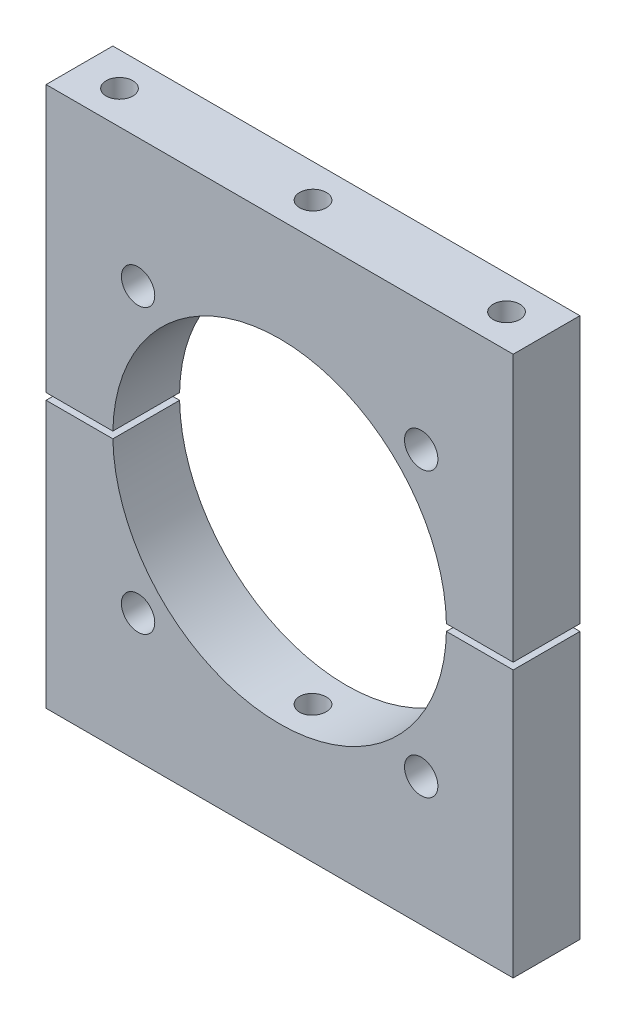
ISO-10303-21;
HEADER;
FILE_DESCRIPTION(('STEP AP214'),'2;1');
FILE_NAME('part.step','',(''),(''),'','','');
FILE_SCHEMA(('AUTOMOTIVE_DESIGN { 1 0 10303 214 1 1 1 1 }'));
ENDSEC;
DATA;
#1=APPLICATION_CONTEXT('core data for automotive mechanical design processes');
#2=APPLICATION_PROTOCOL_DEFINITION('international standard','automotive_design',2000,#1);
#3=PRODUCT_CONTEXT('',#1,'mechanical');
#4=PRODUCT('Part','Part','',(#3));
#5=PRODUCT_RELATED_PRODUCT_CATEGORY('part','',(#4));
#6=PRODUCT_DEFINITION_FORMATION('','',#4);
#7=PRODUCT_DEFINITION_CONTEXT('part definition',#1,'design');
#8=PRODUCT_DEFINITION('design','',#6,#7);
#9=PRODUCT_DEFINITION_SHAPE('','',#8);
#10=(LENGTH_UNIT() NAMED_UNIT(*) SI_UNIT(.MILLI.,.METRE.));
#11=(NAMED_UNIT(*) PLANE_ANGLE_UNIT() SI_UNIT($,.RADIAN.));
#12=(NAMED_UNIT(*) SI_UNIT($,.STERADIAN.) SOLID_ANGLE_UNIT());
#13=UNCERTAINTY_MEASURE_WITH_UNIT(LENGTH_MEASURE(1.E-05),#10,'distance_accuracy_value','');
#14=(GEOMETRIC_REPRESENTATION_CONTEXT(3) GLOBAL_UNCERTAINTY_ASSIGNED_CONTEXT((#13)) GLOBAL_UNIT_ASSIGNED_CONTEXT((#10,
#11,#12)) REPRESENTATION_CONTEXT('',''));
#15=CARTESIAN_POINT('',(0.,0.,0.));
#16=DIRECTION('',(0.,0.,1.));
#17=DIRECTION('',(1.,0.,0.));
#18=AXIS2_PLACEMENT_3D('',#15,#16,#17);
#19=CARTESIAN_POINT('',(0.,0.,10.));
#20=DIRECTION('',(1.,0.,0.));
#21=DIRECTION('',(0.,0.,-1.));
#22=AXIS2_PLACEMENT_3D('',#19,#20,#21);
#23=PLANE('',#22);
#24=DIRECTION('',(0.,-1.,0.));
#25=VECTOR('',#24,1.);
#26=CARTESIAN_POINT('',(0.,0.,10.));
#27=LINE('',#26,#25);
#28=CARTESIAN_POINT('',(0.,39.98,10.));
#29=VERTEX_POINT('',#28);
#30=CARTESIAN_POINT('',(0.,0.,10.));
#31=VERTEX_POINT('',#30);
#32=EDGE_CURVE('E130',#29,#31,#27,.T.);
#33=ORIENTED_EDGE('',*,*,#32,.F.);
#34=DIRECTION('',(0.,0.,1.));
#35=VECTOR('',#34,1.);
#36=CARTESIAN_POINT('',(0.,39.98,0.));
#37=LINE('',#36,#35);
#38=CARTESIAN_POINT('',(0.,39.98,0.));
#39=VERTEX_POINT('',#38);
#40=EDGE_CURVE('E12',#39,#29,#37,.T.);
#41=ORIENTED_EDGE('',*,*,#40,.F.);
#42=DIRECTION('',(0.,-1.,0.));
#43=VECTOR('',#42,1.);
#44=CARTESIAN_POINT('',(0.,0.,0.));
#45=LINE('',#44,#43);
#46=CARTESIAN_POINT('',(0.,0.,0.));
#47=VERTEX_POINT('',#46);
#48=EDGE_CURVE('E132',#39,#47,#45,.T.);
#49=ORIENTED_EDGE('',*,*,#48,.T.);
#50=DIRECTION('',(0.,0.,-1.));
#51=VECTOR('',#50,1.);
#52=CARTESIAN_POINT('',(0.,0.,10.));
#53=LINE('',#52,#51);
#54=EDGE_CURVE('E105',#31,#47,#53,.T.);
#55=ORIENTED_EDGE('',*,*,#54,.F.);
#56=EDGE_LOOP('',(#33,#41,#49,#55));
#57=FACE_BOUND('',#56,.T.);
#58=ADVANCED_FACE('F44',(#57),#23,.F.);
#59=CARTESIAN_POINT('',(0.,0.,10.));
#60=DIRECTION('',(0.,0.,-1.));
#61=DIRECTION('',(-1.,0.,0.));
#62=AXIS2_PLACEMENT_3D('',#59,#60,#61);
#63=PLANE('',#62);
#64=CARTESIAN_POINT('',(13.7867965644037,19.2667965644034,10.));
#65=DIRECTION('',(0.,0.,1.));
#66=DIRECTION('',(1.,0.,0.));
#67=AXIS2_PLACEMENT_3D('',#64,#65,#66);
#68=CIRCLE('',#67,2.50000000000004);
#69=CARTESIAN_POINT('',(16.2867965644037,19.2667965644034,10.));
#70=VERTEX_POINT('',#69);
#71=EDGE_CURVE('E211',#70,#70,#68,.T.);
#72=ORIENTED_EDGE('',*,*,#71,.F.);
#73=EDGE_LOOP('',(#72));
#74=FACE_BOUND('',#73,.T.);
#75=CARTESIAN_POINT('',(56.2132034355965,19.2667965644037,10.));
#76=DIRECTION('',(0.,0.,1.));
#77=DIRECTION('',(1.,0.,0.));
#78=AXIS2_PLACEMENT_3D('',#75,#76,#77);
#79=CIRCLE('',#78,2.50000000000004);
#80=CARTESIAN_POINT('',(58.7132034355966,19.2667965644037,10.));
#81=VERTEX_POINT('',#80);
#82=EDGE_CURVE('E205',#81,#81,#79,.T.);
#83=ORIENTED_EDGE('',*,*,#82,.F.);
#84=EDGE_LOOP('',(#83));
#85=FACE_BOUND('',#84,.T.);
#86=DIRECTION('',(0.,1.,0.));
#87=VECTOR('',#86,1.);
#88=CARTESIAN_POINT('',(70.,0.,10.));
#89=LINE('',#88,#87);
#90=CARTESIAN_POINT('',(70.,0.,10.));
#91=VERTEX_POINT('',#90);
#92=CARTESIAN_POINT('',(70.,39.98,10.));
#93=VERTEX_POINT('',#92);
#94=EDGE_CURVE('E117',#91,#93,#89,.T.);
#95=ORIENTED_EDGE('',*,*,#94,.T.);
#96=DIRECTION('',(1.,0.,0.));
#97=VECTOR('',#96,1.);
#98=CARTESIAN_POINT('',(70.,39.98,10.));
#99=LINE('',#98,#97);
#100=CARTESIAN_POINT('',(59.9949994999,39.98,10.));
#101=VERTEX_POINT('',#100);
#102=EDGE_CURVE('E118',#101,#93,#99,.T.);
#103=ORIENTED_EDGE('',*,*,#102,.F.);
#104=CARTESIAN_POINT('',(35.,40.48,10.));
#105=DIRECTION('',(0.,0.,1.));
#106=DIRECTION('',(1.,0.,0.));
#107=AXIS2_PLACEMENT_3D('',#104,#105,#106);
#108=CIRCLE('',#107,25.);
#109=CARTESIAN_POINT('',(10.0050005001,39.98,10.));
#110=VERTEX_POINT('',#109);
#111=EDGE_CURVE('E190',#110,#101,#108,.T.);
#112=ORIENTED_EDGE('',*,*,#111,.F.);
#113=DIRECTION('',(1.,0.,0.));
#114=VECTOR('',#113,1.);
#115=CARTESIAN_POINT('',(0.,39.98,10.));
#116=LINE('',#115,#114);
#117=EDGE_CURVE('E53',#29,#110,#116,.T.);
#118=ORIENTED_EDGE('',*,*,#117,.F.);
#119=ORIENTED_EDGE('',*,*,#32,.T.);
#120=DIRECTION('',(1.,0.,0.));
#121=VECTOR('',#120,1.);
#122=CARTESIAN_POINT('',(0.,0.,10.));
#123=LINE('',#122,#121);
#124=EDGE_CURVE('E179',#31,#91,#123,.T.);
#125=ORIENTED_EDGE('',*,*,#124,.T.);
#126=EDGE_LOOP('',(#95,#103,#112,#118,#119,#125));
#127=FACE_BOUND('',#126,.T.);
#128=ADVANCED_FACE('F170',(#74,#85,#127),#63,.F.);
#129=CARTESIAN_POINT('',(0.,0.,0.));
#130=DIRECTION('',(0.,0.,-1.));
#131=DIRECTION('',(-1.,0.,0.));
#132=AXIS2_PLACEMENT_3D('',#129,#130,#131);
#133=PLANE('',#132);
#134=CARTESIAN_POINT('',(13.7867965644037,19.2667965644034,0.));
#135=DIRECTION('',(0.,0.,1.));
#136=DIRECTION('',(1.,0.,0.));
#137=AXIS2_PLACEMENT_3D('',#134,#135,#136);
#138=CIRCLE('',#137,2.50000000000004);
#139=CARTESIAN_POINT('',(16.2867965644037,19.2667965644034,0.));
#140=VERTEX_POINT('',#139);
#141=EDGE_CURVE('E200',#140,#140,#138,.T.);
#142=ORIENTED_EDGE('',*,*,#141,.T.);
#143=EDGE_LOOP('',(#142));
#144=FACE_BOUND('',#143,.T.);
#145=CARTESIAN_POINT('',(56.2132034355965,19.2667965644037,0.));
#146=DIRECTION('',(0.,0.,1.));
#147=DIRECTION('',(1.,0.,0.));
#148=AXIS2_PLACEMENT_3D('',#145,#146,#147);
#149=CIRCLE('',#148,2.50000000000004);
#150=CARTESIAN_POINT('',(58.7132034355966,19.2667965644037,0.));
#151=VERTEX_POINT('',#150);
#152=EDGE_CURVE('E208',#151,#151,#149,.T.);
#153=ORIENTED_EDGE('',*,*,#152,.T.);
#154=EDGE_LOOP('',(#153));
#155=FACE_BOUND('',#154,.T.);
#156=DIRECTION('',(1.,0.,0.));
#157=VECTOR('',#156,1.);
#158=CARTESIAN_POINT('',(70.,39.98,0.));
#159=LINE('',#158,#157);
#160=CARTESIAN_POINT('',(59.9949994999,39.98,0.));
#161=VERTEX_POINT('',#160);
#162=CARTESIAN_POINT('',(70.,39.98,0.));
#163=VERTEX_POINT('',#162);
#164=EDGE_CURVE('E124',#161,#163,#159,.T.);
#165=ORIENTED_EDGE('',*,*,#164,.T.);
#166=DIRECTION('',(0.,1.,0.));
#167=VECTOR('',#166,1.);
#168=CARTESIAN_POINT('',(70.,0.,0.));
#169=LINE('',#168,#167);
#170=CARTESIAN_POINT('',(70.,0.,0.));
#171=VERTEX_POINT('',#170);
#172=EDGE_CURVE('E115',#171,#163,#169,.T.);
#173=ORIENTED_EDGE('',*,*,#172,.F.);
#174=DIRECTION('',(1.,0.,0.));
#175=VECTOR('',#174,1.);
#176=CARTESIAN_POINT('',(0.,0.,0.));
#177=LINE('',#176,#175);
#178=EDGE_CURVE('E98',#47,#171,#177,.T.);
#179=ORIENTED_EDGE('',*,*,#178,.F.);
#180=ORIENTED_EDGE('',*,*,#48,.F.);
#181=DIRECTION('',(1.,0.,0.));
#182=VECTOR('',#181,1.);
#183=CARTESIAN_POINT('',(0.,39.98,0.));
#184=LINE('',#183,#182);
#185=CARTESIAN_POINT('',(10.0050005001,39.98,0.));
#186=VERTEX_POINT('',#185);
#187=EDGE_CURVE('E183',#39,#186,#184,.T.);
#188=ORIENTED_EDGE('',*,*,#187,.T.);
#189=CARTESIAN_POINT('',(35.,40.48,0.));
#190=DIRECTION('',(0.,0.,1.));
#191=DIRECTION('',(1.,0.,0.));
#192=AXIS2_PLACEMENT_3D('',#189,#190,#191);
#193=CIRCLE('',#192,25.);
#194=EDGE_CURVE('E109',#186,#161,#193,.T.);
#195=ORIENTED_EDGE('',*,*,#194,.T.);
#196=EDGE_LOOP('',(#165,#173,#179,#180,#188,#195));
#197=FACE_BOUND('',#196,.T.);
#198=ADVANCED_FACE('F122',(#144,#155,#197),#133,.T.);
#199=CARTESIAN_POINT('',(0.,0.,10.));
#200=DIRECTION('',(0.,1.,0.));
#201=DIRECTION('',(0.,0.,1.));
#202=AXIS2_PLACEMENT_3D('',#199,#200,#201);
#203=PLANE('',#202);
#204=CARTESIAN_POINT('',(5.99999999999998,0.,5.));
#205=DIRECTION('',(0.,1.,0.));
#206=DIRECTION('',(-1.,0.,0.));
#207=AXIS2_PLACEMENT_3D('',#204,#205,#206);
#208=CIRCLE('',#207,2.);
#209=CARTESIAN_POINT('',(3.99999999999998,0.,5.));
#210=VERTEX_POINT('',#209);
#211=EDGE_CURVE('E137',#210,#210,#208,.T.);
#212=ORIENTED_EDGE('',*,*,#211,.T.);
#213=EDGE_LOOP('',(#212));
#214=FACE_BOUND('',#213,.T.);
#215=CARTESIAN_POINT('',(64.,0.,5.));
#216=DIRECTION('',(0.,1.,0.));
#217=DIRECTION('',(-1.,0.,0.));
#218=AXIS2_PLACEMENT_3D('',#215,#216,#217);
#219=CIRCLE('',#218,2.);
#220=CARTESIAN_POINT('',(62.,0.,5.));
#221=VERTEX_POINT('',#220);
#222=EDGE_CURVE('E199',#221,#221,#219,.T.);
#223=ORIENTED_EDGE('',*,*,#222,.T.);
#224=EDGE_LOOP('',(#223));
#225=FACE_BOUND('',#224,.T.);
#226=CARTESIAN_POINT('',(35.,0.,5.));
#227=DIRECTION('',(0.,1.,0.));
#228=DIRECTION('',(-1.,0.,0.));
#229=AXIS2_PLACEMENT_3D('',#226,#227,#228);
#230=CIRCLE('',#229,2.);
#231=CARTESIAN_POINT('',(33.,0.,5.));
#232=VERTEX_POINT('',#231);
#233=EDGE_CURVE('E196',#232,#232,#230,.T.);
#234=ORIENTED_EDGE('',*,*,#233,.T.);
#235=EDGE_LOOP('',(#234));
#236=FACE_BOUND('',#235,.T.);
#237=ORIENTED_EDGE('',*,*,#178,.T.);
#238=DIRECTION('',(0.,0.,-1.));
#239=VECTOR('',#238,1.);
#240=CARTESIAN_POINT('',(70.,0.,10.));
#241=LINE('',#240,#239);
#242=EDGE_CURVE('E102',#91,#171,#241,.T.);
#243=ORIENTED_EDGE('',*,*,#242,.F.);
#244=ORIENTED_EDGE('',*,*,#124,.F.);
#245=ORIENTED_EDGE('',*,*,#54,.T.);
#246=EDGE_LOOP('',(#237,#243,#244,#245));
#247=FACE_BOUND('',#246,.T.);
#248=ADVANCED_FACE('F100',(#214,#225,#236,#247),#203,.F.);
#249=CARTESIAN_POINT('',(70.,0.,10.));
#250=DIRECTION('',(-1.,0.,0.));
#251=DIRECTION('',(0.,0.,1.));
#252=AXIS2_PLACEMENT_3D('',#249,#250,#251);
#253=PLANE('',#252);
#254=ORIENTED_EDGE('',*,*,#172,.T.);
#255=DIRECTION('',(0.,0.,1.));
#256=VECTOR('',#255,1.);
#257=CARTESIAN_POINT('',(70.,39.98,0.));
#258=LINE('',#257,#256);
#259=EDGE_CURVE('E119',#163,#93,#258,.T.);
#260=ORIENTED_EDGE('',*,*,#259,.T.);
#261=ORIENTED_EDGE('',*,*,#94,.F.);
#262=ORIENTED_EDGE('',*,*,#242,.T.);
#263=EDGE_LOOP('',(#254,#260,#261,#262));
#264=FACE_BOUND('',#263,.T.);
#265=ADVANCED_FACE('F113',(#264),#253,.F.);
#266=CARTESIAN_POINT('',(70.,39.98,0.));
#267=DIRECTION('',(0.,-1.,0.));
#268=DIRECTION('',(0.,0.,-1.));
#269=AXIS2_PLACEMENT_3D('',#266,#267,#268);
#270=PLANE('',#269);
#271=CARTESIAN_POINT('',(64.,39.98,5.));
#272=DIRECTION('',(0.,-1.,0.));
#273=DIRECTION('',(0.,0.,-1.));
#274=AXIS2_PLACEMENT_3D('',#271,#272,#273);
#275=CIRCLE('',#274,2.);
#276=CARTESIAN_POINT('',(64.,39.98,3.));
#277=VERTEX_POINT('',#276);
#278=EDGE_CURVE('E47',#277,#277,#275,.T.);
#279=ORIENTED_EDGE('',*,*,#278,.T.);
#280=EDGE_LOOP('',(#279));
#281=FACE_BOUND('',#280,.T.);
#282=ORIENTED_EDGE('',*,*,#102,.T.);
#283=ORIENTED_EDGE('',*,*,#259,.F.);
#284=ORIENTED_EDGE('',*,*,#164,.F.);
#285=DIRECTION('',(0.,0.,1.));
#286=VECTOR('',#285,1.);
#287=CARTESIAN_POINT('',(59.9949994999,39.98,0.));
#288=LINE('',#287,#286);
#289=EDGE_CURVE('E76',#161,#101,#288,.T.);
#290=ORIENTED_EDGE('',*,*,#289,.T.);
#291=EDGE_LOOP('',(#282,#283,#284,#290));
#292=FACE_BOUND('',#291,.T.);
#293=ADVANCED_FACE('F167',(#281,#292),#270,.F.);
#294=CARTESIAN_POINT('',(35.,40.48,0.));
#295=DIRECTION('',(0.,0.,1.));
#296=DIRECTION('',(1.,0.,0.));
#297=AXIS2_PLACEMENT_3D('',#294,#295,#296);
#298=CYLINDRICAL_SURFACE('',#297,25.);
#299=CARTESIAN_POINT('',(33.,15.5601284112458,5.));
#300=CARTESIAN_POINT('',(33.0000049058297,15.5601273477315,4.88785214632583));
#301=CARTESIAN_POINT('',(33.0094645837975,15.5593632077122,4.77562755360826));
#302=CARTESIAN_POINT('',(33.0470624163415,15.5563891724289,4.55428234358477));
#303=CARTESIAN_POINT('',(33.0752218385444,15.5541776310451,4.4451654082191));
#304=CARTESIAN_POINT('',(33.1494005463485,15.5485608730392,4.23327344182202));
#305=CARTESIAN_POINT('',(33.1954098318099,15.5451563248858,4.13049489709423));
#306=CARTESIAN_POINT('',(33.3039647194289,15.5375379993332,3.93414429234462));
#307=CARTESIAN_POINT('',(33.3665067414178,15.5333243971889,3.84057024509866));
#308=CARTESIAN_POINT('',(33.5065126422468,15.5245514778246,3.66503758891781));
#309=CARTESIAN_POINT('',(33.5840076675593,15.5199914512523,3.58310385583312));
#310=CARTESIAN_POINT('',(33.7516540723195,15.5110459954793,3.43339121946791));
#311=CARTESIAN_POINT('',(33.8418059998821,15.5066605738506,3.36561292951396));
#312=CARTESIAN_POINT('',(34.0323544420321,15.498551806219,3.24605323296989));
#313=CARTESIAN_POINT('',(34.1327644244599,15.4948293486693,3.19429322537689));
#314=CARTESIAN_POINT('',(34.3408846785481,15.4884735521611,3.10837625933676));
#315=CARTESIAN_POINT('',(34.4485948313103,15.4858401954693,3.0742190142703));
#316=CARTESIAN_POINT('',(34.6680113389855,15.481964259375,3.02454843680447));
#317=CARTESIAN_POINT('',(34.7797085663302,15.4807186902701,3.00899502094729));
#318=CARTESIAN_POINT('',(35.0041346856336,15.4797485493088,2.9968497166359));
#319=CARTESIAN_POINT('',(35.1168635597254,15.4800239511604,3.00025750041233));
#320=CARTESIAN_POINT('',(35.339881278461,15.4820622503752,3.02590503221525));
#321=CARTESIAN_POINT('',(35.4501751157608,15.4838217429086,3.04810167488849));
#322=CARTESIAN_POINT('',(35.6654666002531,15.4886263710155,3.11062984172019));
#323=CARTESIAN_POINT('',(35.7704642004069,15.4916715180054,3.15096152691411));
#324=CARTESIAN_POINT('',(35.9723201008381,15.4987106835816,3.24866309042891));
#325=CARTESIAN_POINT('',(36.0691689982204,15.5027057785343,3.30605231487255));
#326=CARTESIAN_POINT('',(36.2518756725195,15.5111957587957,3.43622583750934));
#327=CARTESIAN_POINT('',(36.3377332442022,15.5156906534338,3.50901042310294));
#328=CARTESIAN_POINT('',(36.4962720389694,15.5246898148867,3.66815161626229));
#329=CARTESIAN_POINT('',(36.5689156773006,15.529194072683,3.75454567206777));
#330=CARTESIAN_POINT('',(36.6986742538885,15.5376916122771,3.93832276653582));
#331=CARTESIAN_POINT('',(36.7557891807526,15.5416848937001,4.03570581326042));
#332=CARTESIAN_POINT('',(36.8528673981887,15.5487091554007,4.2387224857245));
#333=CARTESIAN_POINT('',(36.8928288041141,15.5517400299298,4.34435701654316));
#334=CARTESIAN_POINT('',(36.9544381331901,15.5564943330086,4.56086578550857));
#335=CARTESIAN_POINT('',(36.9760864107929,15.5582177868635,4.67173992219839));
#336=CARTESIAN_POINT('',(37.000407523715,15.560158082566,4.89525189649534));
#337=CARTESIAN_POINT('',(37.0031327414394,15.5603790834359,5.00788399962282));
#338=CARTESIAN_POINT('',(36.9896675278023,15.5593004317213,5.23200349472847));
#339=CARTESIAN_POINT('',(36.9734772588428,15.5580007921926,5.34349089652637));
#340=CARTESIAN_POINT('',(36.9226842955202,15.5540310931234,5.56200629468562));
#341=CARTESIAN_POINT('',(36.8881059892899,15.551362848935,5.66903999573584));
#342=CARTESIAN_POINT('',(36.8015432785373,15.5449581021196,5.87578629884753));
#343=CARTESIAN_POINT('',(36.7495586162864,15.5412215836751,5.97549879248032));
#344=CARTESIAN_POINT('',(36.6295260627595,15.5330912236119,6.16501207928401));
#345=CARTESIAN_POINT('',(36.561443230421,15.5286959598939,6.25479067981362));
#346=CARTESIAN_POINT('',(36.4111974912002,15.5197481922954,6.42166353054961));
#347=CARTESIAN_POINT('',(36.3290343608448,15.5151956859203,6.49875757939723));
#348=CARTESIAN_POINT('',(36.1527341363514,15.5064340453303,6.63825137667553));
#349=CARTESIAN_POINT('',(36.0585700870042,15.5022257202345,6.70061711536531));
#350=CARTESIAN_POINT('',(35.8610755210211,15.4946382618563,6.80865071989545));
#351=CARTESIAN_POINT('',(35.7577450898037,15.4912591208481,6.85431874131599));
#352=CARTESIAN_POINT('',(35.5449733633069,15.4857145134984,6.92760202065291));
#353=CARTESIAN_POINT('',(35.4355393803821,15.4835476277607,6.95523839765751));
#354=CARTESIAN_POINT('',(35.2135664449589,15.4806659334976,6.99174293337583));
#355=CARTESIAN_POINT('',(35.1010275462014,15.4799510998556,7.00061141672435));
#356=CARTESIAN_POINT('',(34.8763748177972,15.4800540057425,6.99932476322648));
#357=CARTESIAN_POINT('',(34.7642606785877,15.4808674722017,6.98922266744312));
#358=CARTESIAN_POINT('',(34.543326600899,15.4839271114284,6.95039211378512));
#359=CARTESIAN_POINT('',(34.434506667172,15.4861732862626,6.92166362904064));
#360=CARTESIAN_POINT('',(34.2232458147354,15.4918462447797,6.84640903482434));
#361=CARTESIAN_POINT('',(34.1208045965355,15.4952729729844,6.79988376167241));
#362=CARTESIAN_POINT('',(33.9251787543047,15.5029234272598,6.69036249537071));
#363=CARTESIAN_POINT('',(33.8319939672824,15.507147139293,6.62736679231073));
#364=CARTESIAN_POINT('',(33.6572549348515,15.5159313591291,6.48649399715609));
#365=CARTESIAN_POINT('',(33.5757323027528,15.5204927333571,6.40857774622938));
#366=CARTESIAN_POINT('',(33.4268903357378,15.5294308395152,6.24014438954589));
#367=CARTESIAN_POINT('',(33.3595744515429,15.53380752638,6.14962423122778));
#368=CARTESIAN_POINT('',(33.2409732717279,15.5418890879804,5.95839006551097));
#369=CARTESIAN_POINT('',(33.1897163652296,15.5455927681731,5.85765841750695));
#370=CARTESIAN_POINT('',(33.1049085973296,15.5518942998002,5.64905850357319));
#371=CARTESIAN_POINT('',(33.0713373109053,15.5544934262035,5.54119863279941));
#372=CARTESIAN_POINT('',(33.0314354938912,15.5576208301853,5.36058173591769));
#373=CARTESIAN_POINT('',(33.0196627768964,15.5585568721275,5.28898746472167));
#374=CARTESIAN_POINT('',(33.003943454081,15.5598110056002,5.14493948037199));
#375=CARTESIAN_POINT('',(32.9999968291605,15.5601290986388,5.07248576931625));
#376=CARTESIAN_POINT('',(33.,15.5601284112458,5.));
#377=B_SPLINE_CURVE_WITH_KNOTS('',3,(#299,#300,#301,#302,#303,#304,#305,#306,#307,#308,#309,
#310,#311,#312,#313,#314,#315,#316,#317,#318,#319,#320,#321,#322,#323,#324,#325,#326,#327,#328,
#329,#330,#331,#332,#333,#334,#335,#336,#337,#338,#339,#340,#341,#342,#343,#344,#345,#346,#347,
#348,#349,#350,#351,#352,#353,#354,#355,#356,#357,#358,#359,#360,#361,#362,#363,#364,#365,#366,
#367,#368,#369,#370,#371,#372,#373,#374,#375,#376),.UNSPECIFIED.,.T.,.F.,(4,2,2,2,2,2,2,2,2,2,2,
2,2,2,2,2,2,2,2,2,2,2,2,2,2,2,2,2,2,2,2,2,2,2,2,2,2,2,4),(0.,0.336178909383881,
0.672740818698466,1.0091144454943,1.34541529007445,1.68242434822536,2.0194480052657,
2.356919971462,2.69438644255223,3.03112449746249,3.36785673142908,3.70381852241059,
4.03978329672298,4.37613057520015,4.71248413315914,5.04977992078598,5.38707595587,
5.72440903998026,6.06173559482743,6.39812799600616,6.73451750905467,7.07046197594159,
7.40641141723674,7.7430968405756,8.07978760805435,8.41724840176262,8.75470605111592,
9.0917677492068,9.42882361697637,9.76493849142071,10.1010538507349,10.4371534170066,
10.7732470640349,11.1102351838792,11.4473050618615,11.7849674942507,12.1222391025421,
12.3395258855511,12.5568121382634),.UNSPECIFIED.);
#378=CARTESIAN_POINT('',(33.,15.5601284112458,5.));
#379=VERTEX_POINT('',#378);
#380=EDGE_CURVE('E136',#379,#379,#377,.T.);
#381=ORIENTED_EDGE('',*,*,#380,.T.);
#382=EDGE_LOOP('',(#381));
#383=FACE_BOUND('',#382,.T.);
#384=ORIENTED_EDGE('',*,*,#111,.T.);
#385=ORIENTED_EDGE('',*,*,#289,.F.);
#386=ORIENTED_EDGE('',*,*,#194,.F.);
#387=DIRECTION('',(0.,0.,1.));
#388=VECTOR('',#387,1.);
#389=CARTESIAN_POINT('',(10.0050005001,39.98,0.));
#390=LINE('',#389,#388);
#391=EDGE_CURVE('E189',#186,#110,#390,.T.);
#392=ORIENTED_EDGE('',*,*,#391,.T.);
#393=EDGE_LOOP('',(#384,#385,#386,#392));
#394=FACE_BOUND('',#393,.T.);
#395=ADVANCED_FACE('F144',(#383,#394),#298,.F.);
#396=CARTESIAN_POINT('',(0.,39.98,0.));
#397=DIRECTION('',(0.,-1.,0.));
#398=DIRECTION('',(0.,0.,-1.));
#399=AXIS2_PLACEMENT_3D('',#396,#397,#398);
#400=PLANE('',#399);
#401=CARTESIAN_POINT('',(5.99999999999999,39.98,5.));
#402=DIRECTION('',(0.,-1.,0.));
#403=DIRECTION('',(0.,0.,-1.));
#404=AXIS2_PLACEMENT_3D('',#401,#402,#403);
#405=CIRCLE('',#404,2.);
#406=CARTESIAN_POINT('',(5.99999999999999,39.98,3.));
#407=VERTEX_POINT('',#406);
#408=EDGE_CURVE('E134',#407,#407,#405,.T.);
#409=ORIENTED_EDGE('',*,*,#408,.T.);
#410=EDGE_LOOP('',(#409));
#411=FACE_BOUND('',#410,.T.);
#412=ORIENTED_EDGE('',*,*,#117,.T.);
#413=ORIENTED_EDGE('',*,*,#391,.F.);
#414=ORIENTED_EDGE('',*,*,#187,.F.);
#415=ORIENTED_EDGE('',*,*,#40,.T.);
#416=EDGE_LOOP('',(#412,#413,#414,#415));
#417=FACE_BOUND('',#416,.T.);
#418=ADVANCED_FACE('F159',(#411,#417),#400,.F.);
#419=CARTESIAN_POINT('',(5.99999999999998,0.,5.));
#420=DIRECTION('',(0.,1.,0.));
#421=DIRECTION('',(-1.,0.,0.));
#422=AXIS2_PLACEMENT_3D('',#419,#420,#421);
#423=CYLINDRICAL_SURFACE('',#422,2.);
#424=ORIENTED_EDGE('',*,*,#211,.F.);
#425=EDGE_LOOP('',(#424));
#426=FACE_BOUND('',#425,.T.);
#427=ORIENTED_EDGE('',*,*,#408,.F.);
#428=EDGE_LOOP('',(#427));
#429=FACE_BOUND('',#428,.T.);
#430=ADVANCED_FACE('F154',(#426,#429),#423,.F.);
#431=CARTESIAN_POINT('',(35.,0.,5.));
#432=DIRECTION('',(0.,1.,0.));
#433=DIRECTION('',(-1.,0.,0.));
#434=AXIS2_PLACEMENT_3D('',#431,#432,#433);
#435=CYLINDRICAL_SURFACE('',#434,2.);
#436=ORIENTED_EDGE('',*,*,#233,.F.);
#437=EDGE_LOOP('',(#436));
#438=FACE_BOUND('',#437,.T.);
#439=ORIENTED_EDGE('',*,*,#380,.F.);
#440=EDGE_LOOP('',(#439));
#441=FACE_BOUND('',#440,.T.);
#442=ADVANCED_FACE('F148',(#438,#441),#435,.F.);
#443=CARTESIAN_POINT('',(64.,0.,5.));
#444=DIRECTION('',(0.,1.,0.));
#445=DIRECTION('',(-1.,0.,0.));
#446=AXIS2_PLACEMENT_3D('',#443,#444,#445);
#447=CYLINDRICAL_SURFACE('',#446,2.);
#448=ORIENTED_EDGE('',*,*,#222,.F.);
#449=EDGE_LOOP('',(#448));
#450=FACE_BOUND('',#449,.T.);
#451=ORIENTED_EDGE('',*,*,#278,.F.);
#452=EDGE_LOOP('',(#451));
#453=FACE_BOUND('',#452,.T.);
#454=ADVANCED_FACE('F153',(#450,#453),#447,.F.);
#455=CARTESIAN_POINT('',(56.2132034355965,19.2667965644037,0.));
#456=DIRECTION('',(0.,0.,1.));
#457=DIRECTION('',(1.,0.,0.));
#458=AXIS2_PLACEMENT_3D('',#455,#456,#457);
#459=CYLINDRICAL_SURFACE('',#458,2.50000000000004);
#460=ORIENTED_EDGE('',*,*,#152,.F.);
#461=EDGE_LOOP('',(#460));
#462=FACE_BOUND('',#461,.T.);
#463=ORIENTED_EDGE('',*,*,#82,.T.);
#464=EDGE_LOOP('',(#463));
#465=FACE_BOUND('',#464,.T.);
#466=ADVANCED_FACE('F222',(#462,#465),#459,.F.);
#467=CARTESIAN_POINT('',(13.7867965644037,19.2667965644034,0.));
#468=DIRECTION('',(0.,0.,1.));
#469=DIRECTION('',(1.,0.,0.));
#470=AXIS2_PLACEMENT_3D('',#467,#468,#469);
#471=CYLINDRICAL_SURFACE('',#470,2.50000000000004);
#472=ORIENTED_EDGE('',*,*,#141,.F.);
#473=EDGE_LOOP('',(#472));
#474=FACE_BOUND('',#473,.T.);
#475=ORIENTED_EDGE('',*,*,#71,.T.);
#476=EDGE_LOOP('',(#475));
#477=FACE_BOUND('',#476,.T.);
#478=ADVANCED_FACE('F219',(#474,#477),#471,.F.);
#479=CLOSED_SHELL('',(#58,#128,#198,#248,#265,#293,#395,#418,#430,#442,#454,#466,#478));
#480=MANIFOLD_SOLID_BREP('B2',#479);
#481=CARTESIAN_POINT('',(0.,80.96,10.));
#482=DIRECTION('',(0.,-1.,0.));
#483=DIRECTION('',(0.,0.,-1.));
#484=AXIS2_PLACEMENT_3D('',#481,#482,#483);
#485=PLANE('',#484);
#486=CARTESIAN_POINT('',(6.,80.96,5.));
#487=DIRECTION('',(0.,1.,0.));
#488=DIRECTION('',(-1.,0.,0.));
#489=AXIS2_PLACEMENT_3D('',#486,#487,#488);
#490=CIRCLE('',#489,2.);
#491=CARTESIAN_POINT('',(4.,80.96,5.));
#492=VERTEX_POINT('',#491);
#493=EDGE_CURVE('E402',#492,#492,#490,.T.);
#494=ORIENTED_EDGE('',*,*,#493,.F.);
#495=EDGE_LOOP('',(#494));
#496=FACE_BOUND('',#495,.T.);
#497=CARTESIAN_POINT('',(64.,80.96,5.));
#498=DIRECTION('',(0.,1.,0.));
#499=DIRECTION('',(-1.,0.,0.));
#500=AXIS2_PLACEMENT_3D('',#497,#498,#499);
#501=CIRCLE('',#500,2.);
#502=CARTESIAN_POINT('',(62.,80.96,5.));
#503=VERTEX_POINT('',#502);
#504=EDGE_CURVE('E476',#503,#503,#501,.T.);
#505=ORIENTED_EDGE('',*,*,#504,.F.);
#506=EDGE_LOOP('',(#505));
#507=FACE_BOUND('',#506,.T.);
#508=CARTESIAN_POINT('',(35.,80.96,5.));
#509=DIRECTION('',(0.,1.,0.));
#510=DIRECTION('',(-1.,0.,0.));
#511=AXIS2_PLACEMENT_3D('',#508,#509,#510);
#512=CIRCLE('',#511,2.);
#513=CARTESIAN_POINT('',(33.,80.96,5.));
#514=VERTEX_POINT('',#513);
#515=EDGE_CURVE('E473',#514,#514,#512,.T.);
#516=ORIENTED_EDGE('',*,*,#515,.F.);
#517=EDGE_LOOP('',(#516));
#518=FACE_BOUND('',#517,.T.);
#519=DIRECTION('',(-1.,0.,0.));
#520=VECTOR('',#519,1.);
#521=CARTESIAN_POINT('',(0.,80.96,0.));
#522=LINE('',#521,#520);
#523=CARTESIAN_POINT('',(70.,80.96,0.));
#524=VERTEX_POINT('',#523);
#525=CARTESIAN_POINT('',(0.,80.96,0.));
#526=VERTEX_POINT('',#525);
#527=EDGE_CURVE('E367',#524,#526,#522,.T.);
#528=ORIENTED_EDGE('',*,*,#527,.T.);
#529=DIRECTION('',(0.,0.,-1.));
#530=VECTOR('',#529,1.);
#531=CARTESIAN_POINT('',(0.,80.96,10.));
#532=LINE('',#531,#530);
#533=CARTESIAN_POINT('',(0.,80.96,10.));
#534=VERTEX_POINT('',#533);
#535=EDGE_CURVE('E338',#534,#526,#532,.T.);
#536=ORIENTED_EDGE('',*,*,#535,.F.);
#537=DIRECTION('',(-1.,0.,0.));
#538=VECTOR('',#537,1.);
#539=CARTESIAN_POINT('',(0.,80.96,10.));
#540=LINE('',#539,#538);
#541=CARTESIAN_POINT('',(70.,80.96,10.));
#542=VERTEX_POINT('',#541);
#543=EDGE_CURVE('E355',#542,#534,#540,.T.);
#544=ORIENTED_EDGE('',*,*,#543,.F.);
#545=DIRECTION('',(0.,0.,-1.));
#546=VECTOR('',#545,1.);
#547=CARTESIAN_POINT('',(70.,80.96,10.));
#548=LINE('',#547,#546);
#549=EDGE_CURVE('E42',#542,#524,#548,.T.);
#550=ORIENTED_EDGE('',*,*,#549,.T.);
#551=EDGE_LOOP('',(#528,#536,#544,#550));
#552=FACE_BOUND('',#551,.T.);
#553=ADVANCED_FACE('F329',(#496,#507,#518,#552),#485,.F.);
#554=CARTESIAN_POINT('',(0.,0.,0.));
#555=DIRECTION('',(0.,0.,-1.));
#556=DIRECTION('',(-1.,0.,0.));
#557=AXIS2_PLACEMENT_3D('',#554,#555,#556);
#558=PLANE('',#557);
#559=CARTESIAN_POINT('',(13.7867965644035,61.6932034355963,0.));
#560=DIRECTION('',(0.,0.,1.));
#561=DIRECTION('',(1.,0.,0.));
#562=AXIS2_PLACEMENT_3D('',#559,#560,#561);
#563=CIRCLE('',#562,2.50000000000004);
#564=CARTESIAN_POINT('',(16.2867965644035,61.6932034355963,0.));
#565=VERTEX_POINT('',#564);
#566=EDGE_CURVE('E477',#565,#565,#563,.T.);
#567=ORIENTED_EDGE('',*,*,#566,.T.);
#568=EDGE_LOOP('',(#567));
#569=FACE_BOUND('',#568,.T.);
#570=CARTESIAN_POINT('',(56.2132034355963,61.6932034355965,0.));
#571=DIRECTION('',(0.,0.,1.));
#572=DIRECTION('',(1.,0.,0.));
#573=AXIS2_PLACEMENT_3D('',#570,#571,#572);
#574=CIRCLE('',#573,2.50000000000002);
#575=CARTESIAN_POINT('',(58.7132034355963,61.6932034355965,0.));
#576=VERTEX_POINT('',#575);
#577=EDGE_CURVE('E485',#576,#576,#574,.T.);
#578=ORIENTED_EDGE('',*,*,#577,.T.);
#579=EDGE_LOOP('',(#578));
#580=FACE_BOUND('',#579,.T.);
#581=DIRECTION('',(-1.,0.,0.));
#582=VECTOR('',#581,1.);
#583=CARTESIAN_POINT('',(59.9949994999,40.98,0.));
#584=LINE('',#583,#582);
#585=CARTESIAN_POINT('',(70.,40.98,0.));
#586=VERTEX_POINT('',#585);
#587=CARTESIAN_POINT('',(59.9949994999,40.98,0.));
#588=VERTEX_POINT('',#587);
#589=EDGE_CURVE('E458',#586,#588,#584,.T.);
#590=ORIENTED_EDGE('',*,*,#589,.T.);
#591=CARTESIAN_POINT('',(35.,40.48,0.));
#592=DIRECTION('',(0.,0.,1.));
#593=DIRECTION('',(1.,0.,0.));
#594=AXIS2_PLACEMENT_3D('',#591,#592,#593);
#595=CIRCLE('',#594,25.);
#596=CARTESIAN_POINT('',(10.0050005001,40.98,0.));
#597=VERTEX_POINT('',#596);
#598=EDGE_CURVE('E464',#588,#597,#595,.T.);
#599=ORIENTED_EDGE('',*,*,#598,.T.);
#600=DIRECTION('',(-1.,0.,0.));
#601=VECTOR('',#600,1.);
#602=CARTESIAN_POINT('',(10.0050005001,40.98,0.));
#603=LINE('',#602,#601);
#604=CARTESIAN_POINT('',(0.,40.98,0.));
#605=VERTEX_POINT('',#604);
#606=EDGE_CURVE('E384',#597,#605,#603,.T.);
#607=ORIENTED_EDGE('',*,*,#606,.T.);
#608=DIRECTION('',(0.,-1.,0.));
#609=VECTOR('',#608,1.);
#610=CARTESIAN_POINT('',(0.,0.,0.));
#611=LINE('',#610,#609);
#612=EDGE_CURVE('E379',#526,#605,#611,.T.);
#613=ORIENTED_EDGE('',*,*,#612,.F.);
#614=ORIENTED_EDGE('',*,*,#527,.F.);
#615=DIRECTION('',(0.,1.,0.));
#616=VECTOR('',#615,1.);
#617=CARTESIAN_POINT('',(70.,0.,0.));
#618=LINE('',#617,#616);
#619=EDGE_CURVE('E375',#586,#524,#618,.T.);
#620=ORIENTED_EDGE('',*,*,#619,.F.);
#621=EDGE_LOOP('',(#590,#599,#607,#613,#614,#620));
#622=FACE_BOUND('',#621,.T.);
#623=ADVANCED_FACE('F382',(#569,#580,#622),#558,.T.);
#624=CARTESIAN_POINT('',(0.,0.,10.));
#625=DIRECTION('',(0.,0.,-1.));
#626=DIRECTION('',(-1.,0.,0.));
#627=AXIS2_PLACEMENT_3D('',#624,#625,#626);
#628=PLANE('',#627);
#629=CARTESIAN_POINT('',(13.7867965644035,61.6932034355963,10.));
#630=DIRECTION('',(0.,0.,1.));
#631=DIRECTION('',(1.,0.,0.));
#632=AXIS2_PLACEMENT_3D('',#629,#630,#631);
#633=CIRCLE('',#632,2.50000000000004);
#634=CARTESIAN_POINT('',(16.2867965644035,61.6932034355963,10.));
#635=VERTEX_POINT('',#634);
#636=EDGE_CURVE('E488',#635,#635,#633,.T.);
#637=ORIENTED_EDGE('',*,*,#636,.F.);
#638=EDGE_LOOP('',(#637));
#639=FACE_BOUND('',#638,.T.);
#640=CARTESIAN_POINT('',(56.2132034355963,61.6932034355965,10.));
#641=DIRECTION('',(0.,0.,1.));
#642=DIRECTION('',(1.,0.,0.));
#643=AXIS2_PLACEMENT_3D('',#640,#641,#642);
#644=CIRCLE('',#643,2.50000000000002);
#645=CARTESIAN_POINT('',(58.7132034355963,61.6932034355965,10.));
#646=VERTEX_POINT('',#645);
#647=EDGE_CURVE('E482',#646,#646,#644,.T.);
#648=ORIENTED_EDGE('',*,*,#647,.F.);
#649=EDGE_LOOP('',(#648));
#650=FACE_BOUND('',#649,.T.);
#651=CARTESIAN_POINT('',(35.,40.48,10.));
#652=DIRECTION('',(0.,0.,1.));
#653=DIRECTION('',(1.,0.,0.));
#654=AXIS2_PLACEMENT_3D('',#651,#652,#653);
#655=CIRCLE('',#654,25.);
#656=CARTESIAN_POINT('',(59.9949994999,40.98,10.));
#657=VERTEX_POINT('',#656);
#658=CARTESIAN_POINT('',(10.0050005001,40.98,10.));
#659=VERTEX_POINT('',#658);
#660=EDGE_CURVE('E467',#657,#659,#655,.T.);
#661=ORIENTED_EDGE('',*,*,#660,.F.);
#662=DIRECTION('',(-1.,0.,0.));
#663=VECTOR('',#662,1.);
#664=CARTESIAN_POINT('',(59.9949994999,40.98,10.));
#665=LINE('',#664,#663);
#666=CARTESIAN_POINT('',(70.,40.98,10.));
#667=VERTEX_POINT('',#666);
#668=EDGE_CURVE('E461',#667,#657,#665,.T.);
#669=ORIENTED_EDGE('',*,*,#668,.F.);
#670=DIRECTION('',(0.,1.,0.));
#671=VECTOR('',#670,1.);
#672=CARTESIAN_POINT('',(70.,0.,10.));
#673=LINE('',#672,#671);
#674=EDGE_CURVE('E446',#667,#542,#673,.T.);
#675=ORIENTED_EDGE('',*,*,#674,.T.);
#676=ORIENTED_EDGE('',*,*,#543,.T.);
#677=DIRECTION('',(0.,-1.,0.));
#678=VECTOR('',#677,1.);
#679=CARTESIAN_POINT('',(0.,0.,10.));
#680=LINE('',#679,#678);
#681=CARTESIAN_POINT('',(0.,40.98,10.));
#682=VERTEX_POINT('',#681);
#683=EDGE_CURVE('E374',#534,#682,#680,.T.);
#684=ORIENTED_EDGE('',*,*,#683,.T.);
#685=DIRECTION('',(-1.,0.,0.));
#686=VECTOR('',#685,1.);
#687=CARTESIAN_POINT('',(10.0050005001,40.98,10.));
#688=LINE('',#687,#686);
#689=EDGE_CURVE('E465',#659,#682,#688,.T.);
#690=ORIENTED_EDGE('',*,*,#689,.F.);
#691=EDGE_LOOP('',(#661,#669,#675,#676,#684,#690));
#692=FACE_BOUND('',#691,.T.);
#693=ADVANCED_FACE('F432',(#639,#650,#692),#628,.F.);
#694=CARTESIAN_POINT('',(70.,0.,10.));
#695=DIRECTION('',(-1.,0.,0.));
#696=DIRECTION('',(0.,0.,1.));
#697=AXIS2_PLACEMENT_3D('',#694,#695,#696);
#698=PLANE('',#697);
#699=ORIENTED_EDGE('',*,*,#674,.F.);
#700=DIRECTION('',(0.,0.,1.));
#701=VECTOR('',#700,1.);
#702=CARTESIAN_POINT('',(70.,40.98,0.));
#703=LINE('',#702,#701);
#704=EDGE_CURVE('E389',#586,#667,#703,.T.);
#705=ORIENTED_EDGE('',*,*,#704,.F.);
#706=ORIENTED_EDGE('',*,*,#619,.T.);
#707=ORIENTED_EDGE('',*,*,#549,.F.);
#708=EDGE_LOOP('',(#699,#705,#706,#707));
#709=FACE_BOUND('',#708,.T.);
#710=ADVANCED_FACE('F424',(#709),#698,.F.);
#711=CARTESIAN_POINT('',(0.,0.,10.));
#712=DIRECTION('',(1.,0.,0.));
#713=DIRECTION('',(0.,0.,-1.));
#714=AXIS2_PLACEMENT_3D('',#711,#712,#713);
#715=PLANE('',#714);
#716=ORIENTED_EDGE('',*,*,#612,.T.);
#717=DIRECTION('',(0.,0.,1.));
#718=VECTOR('',#717,1.);
#719=CARTESIAN_POINT('',(0.,40.98,0.));
#720=LINE('',#719,#718);
#721=EDGE_CURVE('E346',#605,#682,#720,.T.);
#722=ORIENTED_EDGE('',*,*,#721,.T.);
#723=ORIENTED_EDGE('',*,*,#683,.F.);
#724=ORIENTED_EDGE('',*,*,#535,.T.);
#725=EDGE_LOOP('',(#716,#722,#723,#724));
#726=FACE_BOUND('',#725,.T.);
#727=ADVANCED_FACE('F331',(#726),#715,.F.);
#728=CARTESIAN_POINT('',(10.0050005001,40.98,0.));
#729=DIRECTION('',(0.,1.,0.));
#730=DIRECTION('',(-1.,0.,0.));
#731=AXIS2_PLACEMENT_3D('',#728,#729,#730);
#732=PLANE('',#731);
#733=CARTESIAN_POINT('',(5.99999999999999,40.98,5.));
#734=DIRECTION('',(0.,1.,0.));
#735=DIRECTION('',(-1.,0.,0.));
#736=AXIS2_PLACEMENT_3D('',#733,#734,#735);
#737=CIRCLE('',#736,2.);
#738=CARTESIAN_POINT('',(3.99999999999999,40.98,5.));
#739=VERTEX_POINT('',#738);
#740=EDGE_CURVE('E333',#739,#739,#737,.T.);
#741=ORIENTED_EDGE('',*,*,#740,.T.);
#742=EDGE_LOOP('',(#741));
#743=FACE_BOUND('',#742,.T.);
#744=ORIENTED_EDGE('',*,*,#689,.T.);
#745=ORIENTED_EDGE('',*,*,#721,.F.);
#746=ORIENTED_EDGE('',*,*,#606,.F.);
#747=DIRECTION('',(0.,0.,1.));
#748=VECTOR('',#747,1.);
#749=CARTESIAN_POINT('',(10.0050005001,40.98,0.));
#750=LINE('',#749,#748);
#751=EDGE_CURVE('E455',#597,#659,#750,.T.);
#752=ORIENTED_EDGE('',*,*,#751,.T.);
#753=EDGE_LOOP('',(#744,#745,#746,#752));
#754=FACE_BOUND('',#753,.T.);
#755=ADVANCED_FACE('F417',(#743,#754),#732,.F.);
#756=CARTESIAN_POINT('',(59.9949994999,40.98,0.));
#757=DIRECTION('',(0.,1.,0.));
#758=DIRECTION('',(-1.,0.,0.));
#759=AXIS2_PLACEMENT_3D('',#756,#757,#758);
#760=PLANE('',#759);
#761=CARTESIAN_POINT('',(64.,40.98,5.));
#762=DIRECTION('',(0.,1.,0.));
#763=DIRECTION('',(-1.,0.,0.));
#764=AXIS2_PLACEMENT_3D('',#761,#762,#763);
#765=CIRCLE('',#764,2.);
#766=CARTESIAN_POINT('',(62.,40.98,5.));
#767=VERTEX_POINT('',#766);
#768=EDGE_CURVE('E401',#767,#767,#765,.T.);
#769=ORIENTED_EDGE('',*,*,#768,.T.);
#770=EDGE_LOOP('',(#769));
#771=FACE_BOUND('',#770,.T.);
#772=ORIENTED_EDGE('',*,*,#668,.T.);
#773=DIRECTION('',(0.,0.,1.));
#774=VECTOR('',#773,1.);
#775=CARTESIAN_POINT('',(59.9949994999,40.98,0.));
#776=LINE('',#775,#774);
#777=EDGE_CURVE('E385',#588,#657,#776,.T.);
#778=ORIENTED_EDGE('',*,*,#777,.F.);
#779=ORIENTED_EDGE('',*,*,#589,.F.);
#780=ORIENTED_EDGE('',*,*,#704,.T.);
#781=EDGE_LOOP('',(#772,#778,#779,#780));
#782=FACE_BOUND('',#781,.T.);
#783=ADVANCED_FACE('F415',(#771,#782),#760,.F.);
#784=CARTESIAN_POINT('',(35.,40.48,0.));
#785=DIRECTION('',(0.,0.,1.));
#786=DIRECTION('',(1.,0.,0.));
#787=AXIS2_PLACEMENT_3D('',#784,#785,#786);
#788=CYLINDRICAL_SURFACE('',#787,25.);
#789=CARTESIAN_POINT('',(33.,65.3998715887542,5.));
#790=CARTESIAN_POINT('',(33.0000049058297,65.3998726522685,5.11214785367417));
#791=CARTESIAN_POINT('',(33.0094645837976,65.4006367922878,5.22437244639174));
#792=CARTESIAN_POINT('',(33.0470624163415,65.4036108275711,5.44571765641523));
#793=CARTESIAN_POINT('',(33.0752218385444,65.4058223689549,5.5548345917809));
#794=CARTESIAN_POINT('',(33.1494005463485,65.4114391269608,5.76672655817798));
#795=CARTESIAN_POINT('',(33.1954098318099,65.4148436751142,5.86950510290576));
#796=CARTESIAN_POINT('',(33.3039647194289,65.4224620006668,6.06585570765538));
#797=CARTESIAN_POINT('',(33.3665067414178,65.4266756028111,6.15942975490134));
#798=CARTESIAN_POINT('',(33.5065126422468,65.4354485221754,6.33496241108219));
#799=CARTESIAN_POINT('',(33.5840076675594,65.4400085487478,6.41689614416688));
#800=CARTESIAN_POINT('',(33.7516540723195,65.4489540045207,6.56660878053209));
#801=CARTESIAN_POINT('',(33.8418059998821,65.4533394261494,6.63438707048604));
#802=CARTESIAN_POINT('',(34.0323544420321,65.461448193781,6.75394676703011));
#803=CARTESIAN_POINT('',(34.1327644244599,65.4651706513307,6.80570677462311));
#804=CARTESIAN_POINT('',(34.3408846785482,65.4715264478389,6.89162374066324));
#805=CARTESIAN_POINT('',(34.4485948313103,65.4741598045307,6.92578098572971));
#806=CARTESIAN_POINT('',(34.6680113389855,65.478035740625,6.97545156319553));
#807=CARTESIAN_POINT('',(34.7797085663302,65.4792813097299,6.99100497905271));
#808=CARTESIAN_POINT('',(35.0041346856336,65.4802514506912,7.0031502833641));
#809=CARTESIAN_POINT('',(35.1168635597254,65.4799760488396,6.99974249958767));
#810=CARTESIAN_POINT('',(35.339881278461,65.4779377496248,6.97409496778475));
#811=CARTESIAN_POINT('',(35.4501751157608,65.4761782570914,6.95189832511151));
#812=CARTESIAN_POINT('',(35.6654666002531,65.4713736289845,6.88937015827981));
#813=CARTESIAN_POINT('',(35.7704642004069,65.4683284819946,6.84903847308589));
#814=CARTESIAN_POINT('',(35.9723201008381,65.4612893164184,6.75133690957109));
#815=CARTESIAN_POINT('',(36.0691689982205,65.4572942214657,6.69394768512746));
#816=CARTESIAN_POINT('',(36.2518756725195,65.4488042412043,6.56377416249066));
#817=CARTESIAN_POINT('',(36.3377332442022,65.4443093465662,6.49098957689706));
#818=CARTESIAN_POINT('',(36.4962720389694,65.4353101851133,6.33184838373771));
#819=CARTESIAN_POINT('',(36.5689156773006,65.430805927317,6.24545432793224));
#820=CARTESIAN_POINT('',(36.6986742538885,65.4223083877229,6.06167723346418));
#821=CARTESIAN_POINT('',(36.7557891807526,65.4183151062999,5.96429418673958));
#822=CARTESIAN_POINT('',(36.8528673981887,65.4112908445993,5.7612775142755));
#823=CARTESIAN_POINT('',(36.8928288041141,65.4082599700702,5.65564298345684));
#824=CARTESIAN_POINT('',(36.9544381331901,65.4035056669914,5.43913421449143));
#825=CARTESIAN_POINT('',(36.9760864107929,65.4017822131365,5.32826007780161));
#826=CARTESIAN_POINT('',(37.0004075237151,65.399841917434,5.10474810350466));
#827=CARTESIAN_POINT('',(37.0031327414394,65.3996209165641,4.99211600037718));
#828=CARTESIAN_POINT('',(36.9896675278023,65.4006995682787,4.76799650527153));
#829=CARTESIAN_POINT('',(36.9734772588428,65.4019992078074,4.65650910347363));
#830=CARTESIAN_POINT('',(36.9226842955202,65.4059689068766,4.43799370531438));
#831=CARTESIAN_POINT('',(36.8881059892899,65.408637151065,4.33096000426417));
#832=CARTESIAN_POINT('',(36.8015432785373,65.4150418978804,4.12421370115247));
#833=CARTESIAN_POINT('',(36.7495586162864,65.4187784163249,4.02450120751968));
#834=CARTESIAN_POINT('',(36.6295260627595,65.4269087763881,3.83498792071599));
#835=CARTESIAN_POINT('',(36.561443230421,65.4313040401061,3.74520932018639));
#836=CARTESIAN_POINT('',(36.4111974912002,65.4402518077046,3.5783364694504));
#837=CARTESIAN_POINT('',(36.3290343608448,65.4448043140797,3.50124242060278));
#838=CARTESIAN_POINT('',(36.1527341363514,65.4535659546697,3.36174862332447));
#839=CARTESIAN_POINT('',(36.0585700870042,65.4577742797655,3.29938288463469));
#840=CARTESIAN_POINT('',(35.8610755210211,65.4653617381437,3.19134928010455));
#841=CARTESIAN_POINT('',(35.7577450898037,65.4687408791519,3.14568125868401));
#842=CARTESIAN_POINT('',(35.5449733633069,65.4742854865016,3.07239797934709));
#843=CARTESIAN_POINT('',(35.4355393803821,65.4764523722393,3.04476160234249));
#844=CARTESIAN_POINT('',(35.2135664449589,65.4793340665024,3.00825706662417));
#845=CARTESIAN_POINT('',(35.1010275462014,65.4800489001444,2.99938858327565));
#846=CARTESIAN_POINT('',(34.8763748177972,65.4799459942575,3.00067523677352));
#847=CARTESIAN_POINT('',(34.7642606785878,65.4791325277983,3.01077733255688));
#848=CARTESIAN_POINT('',(34.543326600899,65.4760728885716,3.04960788621488));
#849=CARTESIAN_POINT('',(34.434506667172,65.4738267137374,3.07833637095936));
#850=CARTESIAN_POINT('',(34.2232458147354,65.4681537552203,3.15359096517566));
#851=CARTESIAN_POINT('',(34.1208045965355,65.4647270270156,3.20011623832759));
#852=CARTESIAN_POINT('',(33.9251787543047,65.4570765727402,3.30963750462929));
#853=CARTESIAN_POINT('',(33.8319939672824,65.452852860707,3.37263320768927));
#854=CARTESIAN_POINT('',(33.6572549348515,65.4440686408709,3.51350600284391));
#855=CARTESIAN_POINT('',(33.5757323027529,65.4395072666429,3.59142225377062));
#856=CARTESIAN_POINT('',(33.4268903357378,65.4305691604848,3.75985561045411));
#857=CARTESIAN_POINT('',(33.3595744515429,65.42619247362,3.85037576877222));
#858=CARTESIAN_POINT('',(33.2409732717279,65.4181109120197,4.04160993448903));
#859=CARTESIAN_POINT('',(33.1897163652297,65.4144072318269,4.14234158249304));
#860=CARTESIAN_POINT('',(33.1049085973296,65.4081057001999,4.35094149642681));
#861=CARTESIAN_POINT('',(33.0713373109053,65.4055065737965,4.45880136720059));
#862=CARTESIAN_POINT('',(33.0314354938912,65.4023791698147,4.63941826408231));
#863=CARTESIAN_POINT('',(33.0196627768964,65.4014431278725,4.71101253527833));
#864=CARTESIAN_POINT('',(33.003943454081,65.4001889943998,4.85506051962801));
#865=CARTESIAN_POINT('',(32.9999968291605,65.3998709013612,4.92751423068375));
#866=CARTESIAN_POINT('',(33.,65.3998715887542,5.));
#867=B_SPLINE_CURVE_WITH_KNOTS('',3,(#789,#790,#791,#792,#793,#794,#795,#796,#797,#798,#799,
#800,#801,#802,#803,#804,#805,#806,#807,#808,#809,#810,#811,#812,#813,#814,#815,#816,#817,#818,
#819,#820,#821,#822,#823,#824,#825,#826,#827,#828,#829,#830,#831,#832,#833,#834,#835,#836,#837,
#838,#839,#840,#841,#842,#843,#844,#845,#846,#847,#848,#849,#850,#851,#852,#853,#854,#855,#856,
#857,#858,#859,#860,#861,#862,#863,#864,#865,#866),.UNSPECIFIED.,.T.,.F.,(4,2,2,2,2,2,2,2,2,2,2,
2,2,2,2,2,2,2,2,2,2,2,2,2,2,2,2,2,2,2,2,2,2,2,2,2,2,2,4),(0.,0.336178909383881,
0.672740818698467,1.0091144454943,1.34541529007445,1.68242434822536,2.0194480052657,
2.35691997146202,2.69438644255224,3.0311244974625,3.36785673142909,3.70381852241059,
4.03978329672298,4.37613057520015,4.71248413315913,5.04977992078598,5.38707595587,
5.72440903998026,6.06173559482744,6.39812799600616,6.73451750905467,7.07046197594159,
7.40641141723674,7.74309684057559,8.07978760805434,8.41724840176261,8.75470605111592,
9.09176774920681,9.42882361697637,9.76493849142071,10.1010538507349,10.4371534170066,
10.7732470640349,11.1102351838792,11.4473050618615,11.7849674942507,12.1222391025421,
12.3395258855511,12.5568121382634),.UNSPECIFIED.);
#868=CARTESIAN_POINT('',(33.,65.3998715887542,5.));
#869=VERTEX_POINT('',#868);
#870=EDGE_CURVE('E394',#869,#869,#867,.T.);
#871=ORIENTED_EDGE('',*,*,#870,.T.);
#872=EDGE_LOOP('',(#871));
#873=FACE_BOUND('',#872,.T.);
#874=ORIENTED_EDGE('',*,*,#660,.T.);
#875=ORIENTED_EDGE('',*,*,#751,.F.);
#876=ORIENTED_EDGE('',*,*,#598,.F.);
#877=ORIENTED_EDGE('',*,*,#777,.T.);
#878=EDGE_LOOP('',(#874,#875,#876,#877));
#879=FACE_BOUND('',#878,.T.);
#880=ADVANCED_FACE('F403',(#873,#879),#788,.F.);
#881=CARTESIAN_POINT('',(35.,0.,5.));
#882=DIRECTION('',(0.,1.,0.));
#883=DIRECTION('',(-1.,0.,0.));
#884=AXIS2_PLACEMENT_3D('',#881,#882,#883);
#885=CYLINDRICAL_SURFACE('',#884,2.);
#886=ORIENTED_EDGE('',*,*,#515,.T.);
#887=EDGE_LOOP('',(#886));
#888=FACE_BOUND('',#887,.T.);
#889=ORIENTED_EDGE('',*,*,#870,.F.);
#890=EDGE_LOOP('',(#889));
#891=FACE_BOUND('',#890,.T.);
#892=ADVANCED_FACE('F407',(#888,#891),#885,.F.);
#893=CARTESIAN_POINT('',(64.,0.,5.));
#894=DIRECTION('',(0.,1.,0.));
#895=DIRECTION('',(-1.,0.,0.));
#896=AXIS2_PLACEMENT_3D('',#893,#894,#895);
#897=CYLINDRICAL_SURFACE('',#896,2.);
#898=ORIENTED_EDGE('',*,*,#504,.T.);
#899=EDGE_LOOP('',(#898));
#900=FACE_BOUND('',#899,.T.);
#901=ORIENTED_EDGE('',*,*,#768,.F.);
#902=EDGE_LOOP('',(#901));
#903=FACE_BOUND('',#902,.T.);
#904=ADVANCED_FACE('F412',(#900,#903),#897,.F.);
#905=CARTESIAN_POINT('',(5.99999999999998,0.,5.));
#906=DIRECTION('',(0.,1.,0.));
#907=DIRECTION('',(-1.,0.,0.));
#908=AXIS2_PLACEMENT_3D('',#905,#906,#907);
#909=CYLINDRICAL_SURFACE('',#908,2.);
#910=ORIENTED_EDGE('',*,*,#493,.T.);
#911=EDGE_LOOP('',(#910));
#912=FACE_BOUND('',#911,.T.);
#913=ORIENTED_EDGE('',*,*,#740,.F.);
#914=EDGE_LOOP('',(#913));
#915=FACE_BOUND('',#914,.T.);
#916=ADVANCED_FACE('F536',(#912,#915),#909,.F.);
#917=CARTESIAN_POINT('',(56.2132034355963,61.6932034355965,0.));
#918=DIRECTION('',(0.,0.,1.));
#919=DIRECTION('',(1.,0.,0.));
#920=AXIS2_PLACEMENT_3D('',#917,#918,#919);
#921=CYLINDRICAL_SURFACE('',#920,2.50000000000002);
#922=ORIENTED_EDGE('',*,*,#577,.F.);
#923=EDGE_LOOP('',(#922));
#924=FACE_BOUND('',#923,.T.);
#925=ORIENTED_EDGE('',*,*,#647,.T.);
#926=EDGE_LOOP('',(#925));
#927=FACE_BOUND('',#926,.T.);
#928=ADVANCED_FACE('F498',(#924,#927),#921,.F.);
#929=CARTESIAN_POINT('',(13.7867965644035,61.6932034355963,0.));
#930=DIRECTION('',(0.,0.,1.));
#931=DIRECTION('',(1.,0.,0.));
#932=AXIS2_PLACEMENT_3D('',#929,#930,#931);
#933=CYLINDRICAL_SURFACE('',#932,2.50000000000004);
#934=ORIENTED_EDGE('',*,*,#566,.F.);
#935=EDGE_LOOP('',(#934));
#936=FACE_BOUND('',#935,.T.);
#937=ORIENTED_EDGE('',*,*,#636,.T.);
#938=EDGE_LOOP('',(#937));
#939=FACE_BOUND('',#938,.T.);
#940=ADVANCED_FACE('F495',(#936,#939),#933,.F.);
#941=CLOSED_SHELL('',(#553,#623,#693,#710,#727,#755,#783,#880,#892,#904,#916,#928,#940));
#942=MANIFOLD_SOLID_BREP('B6',#941);
#943=ADVANCED_BREP_SHAPE_REPRESENTATION('',(#18,#480,#942),#14);
#944=SHAPE_DEFINITION_REPRESENTATION(#9,#943);
ENDSEC;
END-ISO-10303-21;
